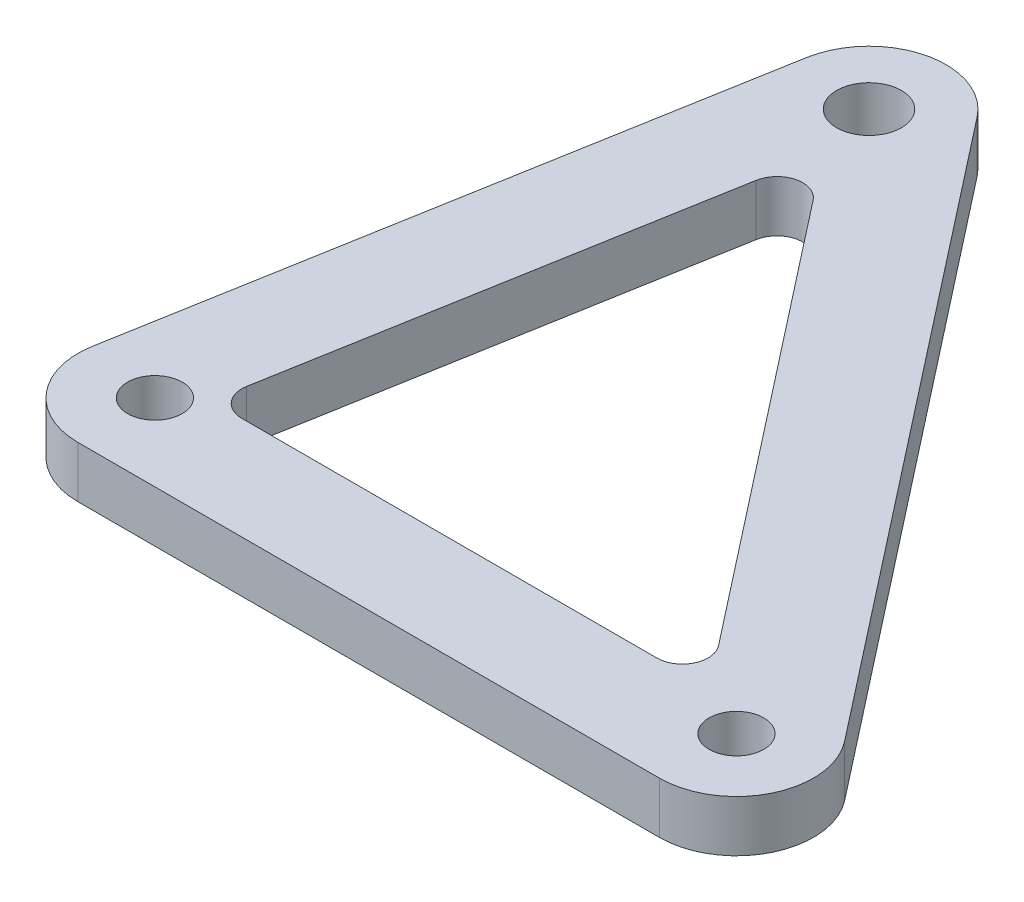
ISO-10303-21;
HEADER;
FILE_DESCRIPTION(('STEP AP214'),'2;1');
FILE_NAME('part.step','',(''),(''),'','','');
FILE_SCHEMA(('AUTOMOTIVE_DESIGN { 1 0 10303 214 1 1 1 1 }'));
ENDSEC;
DATA;
#1=APPLICATION_CONTEXT('core data for automotive mechanical design processes');
#2=APPLICATION_PROTOCOL_DEFINITION('international standard','automotive_design',2000,#1);
#3=PRODUCT_CONTEXT('',#1,'mechanical');
#4=PRODUCT('Part','Part','',(#3));
#5=PRODUCT_RELATED_PRODUCT_CATEGORY('part','',(#4));
#6=PRODUCT_DEFINITION_FORMATION('','',#4);
#7=PRODUCT_DEFINITION_CONTEXT('part definition',#1,'design');
#8=PRODUCT_DEFINITION('design','',#6,#7);
#9=PRODUCT_DEFINITION_SHAPE('','',#8);
#10=(LENGTH_UNIT() NAMED_UNIT(*) SI_UNIT(.MILLI.,.METRE.));
#11=(NAMED_UNIT(*) PLANE_ANGLE_UNIT() SI_UNIT($,.RADIAN.));
#12=(NAMED_UNIT(*) SI_UNIT($,.STERADIAN.) SOLID_ANGLE_UNIT());
#13=UNCERTAINTY_MEASURE_WITH_UNIT(LENGTH_MEASURE(1.E-05),#10,'distance_accuracy_value','');
#14=(GEOMETRIC_REPRESENTATION_CONTEXT(3) GLOBAL_UNCERTAINTY_ASSIGNED_CONTEXT((#13)) GLOBAL_UNIT_ASSIGNED_CONTEXT((#10,
#11,#12)) REPRESENTATION_CONTEXT('',''));
#15=CARTESIAN_POINT('',(0.,0.,0.));
#16=DIRECTION('',(0.,0.,1.));
#17=DIRECTION('',(1.,0.,0.));
#18=AXIS2_PLACEMENT_3D('',#15,#16,#17);
#19=CARTESIAN_POINT('',(7.56664920906916,6.35,-6.35));
#20=DIRECTION('',(0.,-1.,0.));
#21=DIRECTION('',(0.,0.,-1.));
#22=AXIS2_PLACEMENT_3D('',#19,#20,#21);
#23=CYLINDRICAL_SURFACE('',#22,3.17500000000001);
#24=CARTESIAN_POINT('',(7.56664920906916,0.,-6.35));
#25=DIRECTION('',(0.,1.,0.));
#26=DIRECTION('',(0.,0.,1.));
#27=AXIS2_PLACEMENT_3D('',#24,#25,#26);
#28=CIRCLE('',#27,3.17500000000001);
#29=CARTESIAN_POINT('',(7.56664920906916,0.,-3.175));
#30=VERTEX_POINT('',#29);
#31=CARTESIAN_POINT('',(4.43981386335675,0.,-6.90093168433451));
#32=VERTEX_POINT('',#31);
#33=EDGE_CURVE('E192',#30,#32,#28,.F.);
#34=ORIENTED_EDGE('',*,*,#33,.T.);
#35=DIRECTION('',(0.,-1.,0.));
#36=VECTOR('',#35,1.);
#37=CARTESIAN_POINT('',(4.43981386335675,6.35,-6.90093168433451));
#38=LINE('',#37,#36);
#39=CARTESIAN_POINT('',(4.43981386335675,6.35,-6.90093168433451));
#40=VERTEX_POINT('',#39);
#41=EDGE_CURVE('E11',#40,#32,#38,.T.);
#42=ORIENTED_EDGE('',*,*,#41,.F.);
#43=CARTESIAN_POINT('',(7.56664920906916,6.35,-6.35));
#44=DIRECTION('',(0.,1.,0.));
#45=DIRECTION('',(0.,0.,1.));
#46=AXIS2_PLACEMENT_3D('',#43,#44,#45);
#47=CIRCLE('',#46,3.17500000000001);
#48=CARTESIAN_POINT('',(7.56664920906916,6.35,-3.175));
#49=VERTEX_POINT('',#48);
#50=EDGE_CURVE('E264',#49,#40,#47,.F.);
#51=ORIENTED_EDGE('',*,*,#50,.F.);
#52=DIRECTION('',(0.,-1.,0.));
#53=VECTOR('',#52,1.);
#54=CARTESIAN_POINT('',(7.56664920906916,6.35,-3.175));
#55=LINE('',#54,#53);
#56=EDGE_CURVE('E214',#49,#30,#55,.T.);
#57=ORIENTED_EDGE('',*,*,#56,.T.);
#58=EDGE_LOOP('',(#34,#42,#51,#57));
#59=FACE_BOUND('',#58,.T.);
#60=ADVANCED_FACE('F45',(#59),#23,.F.);
#61=CARTESIAN_POINT('',(3.12683534571238,6.35,0.55093168433451));
#62=DIRECTION('',(-0.984830030145635,0.,-0.173521790341578));
#63=DIRECTION('',(-0.173521790341578,0.,0.984830030145636));
#64=AXIS2_PLACEMENT_3D('',#61,#62,#63);
#65=PLANE('',#64);
#66=DIRECTION('',(0.173521790341579,0.,-0.984830030145636));
#67=VECTOR('',#66,1.);
#68=CARTESIAN_POINT('',(3.12683534571238,0.,0.55093168433451));
#69=LINE('',#68,#67);
#70=CARTESIAN_POINT('',(13.8747362557186,0.,-60.4492202641175));
#71=VERTEX_POINT('',#70);
#72=EDGE_CURVE('E195',#32,#71,#69,.T.);
#73=ORIENTED_EDGE('',*,*,#72,.T.);
#74=DIRECTION('',(0.,-1.,0.));
#75=VECTOR('',#74,1.);
#76=CARTESIAN_POINT('',(13.8747362557186,6.35,-60.4492202641175));
#77=LINE('',#76,#75);
#78=CARTESIAN_POINT('',(13.8747362557186,6.35,-60.4492202641175));
#79=VERTEX_POINT('',#78);
#80=EDGE_CURVE('E55',#79,#71,#77,.T.);
#81=ORIENTED_EDGE('',*,*,#80,.F.);
#82=DIRECTION('',(0.173521790341579,0.,-0.984830030145636));
#83=VECTOR('',#82,1.);
#84=CARTESIAN_POINT('',(3.12683534571238,6.35,0.55093168433451));
#85=LINE('',#84,#83);
#86=EDGE_CURVE('E266',#40,#79,#85,.T.);
#87=ORIENTED_EDGE('',*,*,#86,.F.);
#88=ORIENTED_EDGE('',*,*,#41,.T.);
#89=EDGE_LOOP('',(#73,#81,#87,#88));
#90=FACE_BOUND('',#89,.T.);
#91=ADVANCED_FACE('F293',(#90),#65,.F.);
#92=CARTESIAN_POINT('',(17.001571601431,6.35,-59.8982885797829));
#93=DIRECTION('',(0.,-1.,0.));
#94=DIRECTION('',(0.,0.,-1.));
#95=AXIS2_PLACEMENT_3D('',#92,#93,#94);
#96=CYLINDRICAL_SURFACE('',#95,3.175);
#97=CARTESIAN_POINT('',(17.001571601431,0.,-59.8982885797829));
#98=DIRECTION('',(0.,1.,0.));
#99=DIRECTION('',(0.,0.,1.));
#100=AXIS2_PLACEMENT_3D('',#97,#98,#99);
#101=CIRCLE('',#100,3.175);
#102=CARTESIAN_POINT('',(19.5030398780009,0.,-61.853609898982));
#103=VERTEX_POINT('',#102);
#104=EDGE_CURVE('E198',#103,#71,#101,.T.);
#105=ORIENTED_EDGE('',*,*,#104,.F.);
#106=DIRECTION('',(0.,-1.,0.));
#107=VECTOR('',#106,1.);
#108=CARTESIAN_POINT('',(19.5030398780009,6.35,-61.853609898982));
#109=LINE('',#108,#107);
#110=CARTESIAN_POINT('',(19.5030398780009,6.35,-61.853609898982));
#111=VERTEX_POINT('',#110);
#112=EDGE_CURVE('E161',#111,#103,#109,.T.);
#113=ORIENTED_EDGE('',*,*,#112,.F.);
#114=CARTESIAN_POINT('',(17.001571601431,6.35,-59.8982885797829));
#115=DIRECTION('',(0.,1.,0.));
#116=DIRECTION('',(0.,0.,1.));
#117=AXIS2_PLACEMENT_3D('',#114,#115,#116);
#118=CIRCLE('',#117,3.175);
#119=EDGE_CURVE('E154',#111,#79,#118,.T.);
#120=ORIENTED_EDGE('',*,*,#119,.T.);
#121=ORIENTED_EDGE('',*,*,#80,.T.);
#122=EDGE_LOOP('',(#105,#113,#120,#121));
#123=FACE_BOUND('',#122,.T.);
#124=ADVANCED_FACE('F269',(#123),#96,.F.);
#125=CARTESIAN_POINT('',(42.1178254921996,6.35,-32.9222172731807));
#126=DIRECTION('',(0.787864024116508,0.,-0.615849234393404));
#127=DIRECTION('',(-0.615849234393404,0.,-0.787864024116508));
#128=AXIS2_PLACEMENT_3D('',#125,#126,#127);
#129=PLANE('',#128);
#130=DIRECTION('',(0.615849234393404,0.,0.787864024116508));
#131=VECTOR('',#130,1.);
#132=CARTESIAN_POINT('',(42.1178254921996,0.,-32.9222172731807));
#133=LINE('',#132,#131);
#134=CARTESIAN_POINT('',(61.3601008878836,0.,-8.30532131919906));
#135=VERTEX_POINT('',#134);
#136=EDGE_CURVE('E160',#103,#135,#133,.T.);
#137=ORIENTED_EDGE('',*,*,#136,.T.);
#138=DIRECTION('',(0.,-1.,0.));
#139=VECTOR('',#138,1.);
#140=CARTESIAN_POINT('',(61.3601008878836,6.35,-8.30532131919906));
#141=LINE('',#140,#139);
#142=CARTESIAN_POINT('',(61.3601008878836,6.35,-8.30532131919906));
#143=VERTEX_POINT('',#142);
#144=EDGE_CURVE('E157',#143,#135,#141,.T.);
#145=ORIENTED_EDGE('',*,*,#144,.F.);
#146=DIRECTION('',(0.615849234393404,0.,0.787864024116508));
#147=VECTOR('',#146,1.);
#148=CARTESIAN_POINT('',(42.1178254921996,6.35,-32.9222172731807));
#149=LINE('',#148,#147);
#150=EDGE_CURVE('E147',#111,#143,#149,.T.);
#151=ORIENTED_EDGE('',*,*,#150,.F.);
#152=ORIENTED_EDGE('',*,*,#112,.T.);
#153=EDGE_LOOP('',(#137,#145,#151,#152));
#154=FACE_BOUND('',#153,.T.);
#155=ADVANCED_FACE('F158',(#154),#129,.F.);
#156=CARTESIAN_POINT('',(58.8586326113137,6.35,-6.35));
#157=DIRECTION('',(0.,-1.,0.));
#158=DIRECTION('',(0.,0.,-1.));
#159=AXIS2_PLACEMENT_3D('',#156,#157,#158);
#160=CYLINDRICAL_SURFACE('',#159,3.175);
#161=CARTESIAN_POINT('',(58.8586326113137,0.,-6.35));
#162=DIRECTION('',(0.,1.,0.));
#163=DIRECTION('',(0.,0.,1.));
#164=AXIS2_PLACEMENT_3D('',#161,#162,#163);
#165=CIRCLE('',#164,3.175);
#166=CARTESIAN_POINT('',(58.8586326113137,0.,-3.175));
#167=VERTEX_POINT('',#166);
#168=EDGE_CURVE('E105',#135,#167,#165,.F.);
#169=ORIENTED_EDGE('',*,*,#168,.T.);
#170=DIRECTION('',(0.,-1.,0.));
#171=VECTOR('',#170,1.);
#172=CARTESIAN_POINT('',(58.8586326113137,6.35,-3.175));
#173=LINE('',#172,#171);
#174=CARTESIAN_POINT('',(58.8586326113137,6.35,-3.175));
#175=VERTEX_POINT('',#174);
#176=EDGE_CURVE('E162',#175,#167,#173,.T.);
#177=ORIENTED_EDGE('',*,*,#176,.F.);
#178=CARTESIAN_POINT('',(58.8586326113137,6.35,-6.35));
#179=DIRECTION('',(0.,1.,0.));
#180=DIRECTION('',(0.,0.,1.));
#181=AXIS2_PLACEMENT_3D('',#178,#179,#180);
#182=CIRCLE('',#181,3.175);
#183=EDGE_CURVE('E152',#143,#175,#182,.F.);
#184=ORIENTED_EDGE('',*,*,#183,.F.);
#185=ORIENTED_EDGE('',*,*,#144,.T.);
#186=EDGE_LOOP('',(#169,#177,#184,#185));
#187=FACE_BOUND('',#186,.T.);
#188=ADVANCED_FACE('F164',(#187),#160,.F.);
#189=CARTESIAN_POINT('',(-9.38050603713716,6.35,-1.65279505300353));
#190=DIRECTION('',(0.984830030145635,0.,0.173521790341578));
#191=DIRECTION('',(0.173521790341579,0.,-0.984830030145636));
#192=AXIS2_PLACEMENT_3D('',#189,#190,#191);
#193=PLANE('',#192);
#194=DIRECTION('',(-0.173521790341579,0.,0.984830030145635));
#195=VECTOR('',#194,1.);
#196=CARTESIAN_POINT('',(-9.38050603713716,0.,-1.65279505300353));
#197=LINE('',#196,#195);
#198=CARTESIAN_POINT('',(3.8418543868911,0.,-76.696843350101));
#199=VERTEX_POINT('',#198);
#200=CARTESIAN_POINT('',(-9.38050603713717,0.,-1.65279505300353));
#201=VERTEX_POINT('',#200);
#202=EDGE_CURVE('E179',#199,#201,#197,.T.);
#203=ORIENTED_EDGE('',*,*,#202,.T.);
#204=DIRECTION('',(0.,-1.,0.));
#205=VECTOR('',#204,1.);
#206=CARTESIAN_POINT('',(-9.38050603713717,6.35,-1.65279505300353));
#207=LINE('',#206,#205);
#208=CARTESIAN_POINT('',(-9.38050603713717,6.35,-1.65279505300353));
#209=VERTEX_POINT('',#208);
#210=EDGE_CURVE('E49',#209,#201,#207,.T.);
#211=ORIENTED_EDGE('',*,*,#210,.F.);
#212=DIRECTION('',(-0.173521790341579,0.,0.984830030145635));
#213=VECTOR('',#212,1.);
#214=CARTESIAN_POINT('',(-9.38050603713716,6.35,-1.65279505300353));
#215=LINE('',#214,#213);
#216=CARTESIAN_POINT('',(3.8418543868911,6.35,-76.696843350101));
#217=VERTEX_POINT('',#216);
#218=EDGE_CURVE('E213',#217,#209,#215,.T.);
#219=ORIENTED_EDGE('',*,*,#218,.F.);
#220=DIRECTION('',(0.,-1.,0.));
#221=VECTOR('',#220,1.);
#222=CARTESIAN_POINT('',(3.8418543868911,6.35,-76.696843350101));
#223=LINE('',#222,#221);
#224=EDGE_CURVE('E178',#217,#199,#223,.T.);
#225=ORIENTED_EDGE('',*,*,#224,.T.);
#226=EDGE_LOOP('',(#203,#211,#219,#225));
#227=FACE_BOUND('',#226,.T.);
#228=ADVANCED_FACE('F47',(#227),#193,.F.);
#229=CARTESIAN_POINT('',(0.,6.35,0.));
#230=DIRECTION('',(0.,-1.,0.));
#231=DIRECTION('',(0.,0.,-1.));
#232=AXIS2_PLACEMENT_3D('',#229,#230,#231);
#233=CYLINDRICAL_SURFACE('',#232,9.525);
#234=CARTESIAN_POINT('',(0.,0.,0.));
#235=DIRECTION('',(0.,1.,0.));
#236=DIRECTION('',(0.,0.,1.));
#237=AXIS2_PLACEMENT_3D('',#234,#235,#236);
#238=CIRCLE('',#237,9.525);
#239=CARTESIAN_POINT('',(0.,0.,9.525));
#240=VERTEX_POINT('',#239);
#241=EDGE_CURVE('E182',#201,#240,#238,.T.);
#242=ORIENTED_EDGE('',*,*,#241,.T.);
#243=DIRECTION('',(0.,-1.,0.));
#244=VECTOR('',#243,1.);
#245=CARTESIAN_POINT('',(0.,6.35,9.525));
#246=LINE('',#245,#244);
#247=CARTESIAN_POINT('',(0.,6.35,9.525));
#248=VERTEX_POINT('',#247);
#249=EDGE_CURVE('E229',#248,#240,#246,.T.);
#250=ORIENTED_EDGE('',*,*,#249,.F.);
#251=CARTESIAN_POINT('',(0.,6.35,0.));
#252=DIRECTION('',(0.,1.,0.));
#253=DIRECTION('',(0.,0.,1.));
#254=AXIS2_PLACEMENT_3D('',#251,#252,#253);
#255=CIRCLE('',#254,9.525);
#256=EDGE_CURVE('E120',#209,#248,#255,.T.);
#257=ORIENTED_EDGE('',*,*,#256,.F.);
#258=ORIENTED_EDGE('',*,*,#210,.T.);
#259=EDGE_LOOP('',(#242,#250,#257,#258));
#260=FACE_BOUND('',#259,.T.);
#261=ADVANCED_FACE('F235',(#260),#233,.T.);
#262=CARTESIAN_POINT('',(0.,6.35,9.525));
#263=DIRECTION('',(0.,0.,-1.));
#264=DIRECTION('',(-1.,0.,0.));
#265=AXIS2_PLACEMENT_3D('',#262,#263,#264);
#266=PLANE('',#265);
#267=DIRECTION('',(1.,0.,0.));
#268=VECTOR('',#267,1.);
#269=CARTESIAN_POINT('',(0.,0.,9.525));
#270=LINE('',#269,#268);
#271=CARTESIAN_POINT('',(71.882,0.,9.52500000000001));
#272=VERTEX_POINT('',#271);
#273=EDGE_CURVE('E184',#240,#272,#270,.T.);
#274=ORIENTED_EDGE('',*,*,#273,.T.);
#275=DIRECTION('',(0.,-1.,0.));
#276=VECTOR('',#275,1.);
#277=CARTESIAN_POINT('',(71.882,6.35,9.52500000000001));
#278=LINE('',#277,#276);
#279=CARTESIAN_POINT('',(71.882,6.35,9.52500000000001));
#280=VERTEX_POINT('',#279);
#281=EDGE_CURVE('E227',#280,#272,#278,.T.);
#282=ORIENTED_EDGE('',*,*,#281,.F.);
#283=DIRECTION('',(1.,0.,0.));
#284=VECTOR('',#283,1.);
#285=CARTESIAN_POINT('',(0.,6.35,9.525));
#286=LINE('',#285,#284);
#287=EDGE_CURVE('E256',#248,#280,#286,.T.);
#288=ORIENTED_EDGE('',*,*,#287,.F.);
#289=ORIENTED_EDGE('',*,*,#249,.T.);
#290=EDGE_LOOP('',(#274,#282,#288,#289));
#291=FACE_BOUND('',#290,.T.);
#292=ADVANCED_FACE('F247',(#291),#266,.F.);
#293=CARTESIAN_POINT('',(71.882,6.35,0.));
#294=DIRECTION('',(0.,-1.,0.));
#295=DIRECTION('',(0.,0.,-1.));
#296=AXIS2_PLACEMENT_3D('',#293,#294,#295);
#297=CYLINDRICAL_SURFACE('',#296,9.52500000000001);
#298=CARTESIAN_POINT('',(71.882,0.,0.));
#299=DIRECTION('',(0.,1.,0.));
#300=DIRECTION('',(0.,0.,1.));
#301=AXIS2_PLACEMENT_3D('',#298,#299,#300);
#302=CIRCLE('',#301,9.52500000000001);
#303=CARTESIAN_POINT('',(79.3864048297097,0.,-5.86596395759717));
#304=VERTEX_POINT('',#303);
#305=EDGE_CURVE('E186',#272,#304,#302,.T.);
#306=ORIENTED_EDGE('',*,*,#305,.T.);
#307=DIRECTION('',(0.,-1.,0.));
#308=VECTOR('',#307,1.);
#309=CARTESIAN_POINT('',(79.3864048297097,6.35,-5.86596395759717));
#310=LINE('',#309,#308);
#311=CARTESIAN_POINT('',(79.3864048297097,6.35,-5.86596395759717));
#312=VERTEX_POINT('',#311);
#313=EDGE_CURVE('E224',#312,#304,#310,.T.);
#314=ORIENTED_EDGE('',*,*,#313,.F.);
#315=CARTESIAN_POINT('',(71.882,6.35,0.));
#316=DIRECTION('',(0.,1.,0.));
#317=DIRECTION('',(0.,0.,1.));
#318=AXIS2_PLACEMENT_3D('',#315,#316,#317);
#319=CIRCLE('',#318,9.52500000000001);
#320=EDGE_CURVE('E252',#280,#312,#319,.T.);
#321=ORIENTED_EDGE('',*,*,#320,.F.);
#322=ORIENTED_EDGE('',*,*,#281,.T.);
#323=EDGE_LOOP('',(#306,#314,#321,#322));
#324=FACE_BOUND('',#323,.T.);
#325=ADVANCED_FACE('F250',(#324),#297,.T.);
#326=CARTESIAN_POINT('',(52.1236985984793,6.35,-40.7435025499769));
#327=DIRECTION('',(-0.787864024116509,0.,0.615849234393404));
#328=DIRECTION('',(0.615849234393404,0.,0.787864024116509));
#329=AXIS2_PLACEMENT_3D('',#326,#327,#328);
#330=PLANE('',#329);
#331=DIRECTION('',(-0.615849234393404,0.,-0.787864024116509));
#332=VECTOR('',#331,1.);
#333=CARTESIAN_POINT('',(52.1236985984793,0.,-40.7435025499769));
#334=LINE('',#333,#332);
#335=CARTESIAN_POINT('',(20.726765253738,0.,-80.9100122546946));
#336=VERTEX_POINT('',#335);
#337=EDGE_CURVE('E188',#304,#336,#334,.T.);
#338=ORIENTED_EDGE('',*,*,#337,.T.);
#339=DIRECTION('',(0.,-1.,0.));
#340=VECTOR('',#339,1.);
#341=CARTESIAN_POINT('',(20.726765253738,6.35,-80.9100122546946));
#342=LINE('',#341,#340);
#343=CARTESIAN_POINT('',(20.726765253738,6.35,-80.9100122546946));
#344=VERTEX_POINT('',#343);
#345=EDGE_CURVE('E221',#344,#336,#342,.T.);
#346=ORIENTED_EDGE('',*,*,#345,.F.);
#347=DIRECTION('',(-0.615849234393404,0.,-0.787864024116509));
#348=VECTOR('',#347,1.);
#349=CARTESIAN_POINT('',(52.1236985984793,6.35,-40.7435025499769));
#350=LINE('',#349,#348);
#351=EDGE_CURVE('E255',#312,#344,#350,.T.);
#352=ORIENTED_EDGE('',*,*,#351,.F.);
#353=ORIENTED_EDGE('',*,*,#313,.T.);
#354=EDGE_LOOP('',(#338,#346,#352,#353));
#355=FACE_BOUND('',#354,.T.);
#356=ADVANCED_FACE('F302',(#355),#330,.F.);
#357=CARTESIAN_POINT('',(0.,6.35,0.));
#358=DIRECTION('',(0.,-1.,0.));
#359=DIRECTION('',(0.,0.,-1.));
#360=AXIS2_PLACEMENT_3D('',#357,#358,#359);
#361=CYLINDRICAL_SURFACE('',#360,3.3782);
#362=CARTESIAN_POINT('',(0.,6.35,0.));
#363=DIRECTION('',(0.,1.,0.));
#364=DIRECTION('',(0.,0.,1.));
#365=AXIS2_PLACEMENT_3D('',#362,#363,#364);
#366=CIRCLE('',#365,3.3782);
#367=CARTESIAN_POINT('',(0.,6.35,3.3782));
#368=VERTEX_POINT('',#367);
#369=EDGE_CURVE('E172',#368,#368,#366,.T.);
#370=ORIENTED_EDGE('',*,*,#369,.T.);
#371=EDGE_LOOP('',(#370));
#372=FACE_BOUND('',#371,.T.);
#373=CARTESIAN_POINT('',(0.,0.,0.));
#374=DIRECTION('',(0.,1.,0.));
#375=DIRECTION('',(0.,0.,1.));
#376=AXIS2_PLACEMENT_3D('',#373,#374,#375);
#377=CIRCLE('',#376,3.3782);
#378=CARTESIAN_POINT('',(0.,0.,3.3782));
#379=VERTEX_POINT('',#378);
#380=EDGE_CURVE('E207',#379,#379,#377,.T.);
#381=ORIENTED_EDGE('',*,*,#380,.F.);
#382=EDGE_LOOP('',(#381));
#383=FACE_BOUND('',#382,.T.);
#384=ADVANCED_FACE('F288',(#372,#383),#361,.F.);
#385=CARTESIAN_POINT('',(71.882,6.35,0.));
#386=DIRECTION('',(0.,-1.,0.));
#387=DIRECTION('',(0.,0.,-1.));
#388=AXIS2_PLACEMENT_3D('',#385,#386,#387);
#389=CYLINDRICAL_SURFACE('',#388,3.37819999999999);
#390=CARTESIAN_POINT('',(71.882,6.35,0.));
#391=DIRECTION('',(0.,1.,0.));
#392=DIRECTION('',(0.,0.,1.));
#393=AXIS2_PLACEMENT_3D('',#390,#391,#392);
#394=CIRCLE('',#393,3.37819999999999);
#395=CARTESIAN_POINT('',(71.882,6.35,3.37819999999999));
#396=VERTEX_POINT('',#395);
#397=EDGE_CURVE('E166',#396,#396,#394,.T.);
#398=ORIENTED_EDGE('',*,*,#397,.T.);
#399=EDGE_LOOP('',(#398));
#400=FACE_BOUND('',#399,.T.);
#401=CARTESIAN_POINT('',(71.882,0.,0.));
#402=DIRECTION('',(0.,1.,0.));
#403=DIRECTION('',(0.,0.,1.));
#404=AXIS2_PLACEMENT_3D('',#401,#402,#403);
#405=CIRCLE('',#404,3.37819999999999);
#406=CARTESIAN_POINT('',(71.882,0.,3.37819999999999));
#407=VERTEX_POINT('',#406);
#408=EDGE_CURVE('E204',#407,#407,#405,.T.);
#409=ORIENTED_EDGE('',*,*,#408,.F.);
#410=EDGE_LOOP('',(#409));
#411=FACE_BOUND('',#410,.T.);
#412=ADVANCED_FACE('F279',(#400,#411),#389,.F.);
#413=CARTESIAN_POINT('',(0.,6.35,-3.175));
#414=DIRECTION('',(0.,0.,1.));
#415=DIRECTION('',(1.,0.,0.));
#416=AXIS2_PLACEMENT_3D('',#413,#414,#415);
#417=PLANE('',#416);
#418=DIRECTION('',(-1.,0.,0.));
#419=VECTOR('',#418,1.);
#420=CARTESIAN_POINT('',(0.,0.,-3.175));
#421=LINE('',#420,#419);
#422=EDGE_CURVE('E111',#167,#30,#421,.T.);
#423=ORIENTED_EDGE('',*,*,#422,.T.);
#424=ORIENTED_EDGE('',*,*,#56,.F.);
#425=DIRECTION('',(-1.,0.,0.));
#426=VECTOR('',#425,1.);
#427=CARTESIAN_POINT('',(0.,6.35,-3.175));
#428=LINE('',#427,#426);
#429=EDGE_CURVE('E64',#175,#49,#428,.T.);
#430=ORIENTED_EDGE('',*,*,#429,.F.);
#431=ORIENTED_EDGE('',*,*,#176,.T.);
#432=EDGE_LOOP('',(#423,#424,#430,#431));
#433=FACE_BOUND('',#432,.T.);
#434=ADVANCED_FACE('F276',(#433),#417,.F.);
#435=CARTESIAN_POINT('',(13.2223604240283,6.35,-75.0440482970974));
#436=DIRECTION('',(0.,-1.,0.));
#437=DIRECTION('',(0.,0.,-1.));
#438=AXIS2_PLACEMENT_3D('',#435,#436,#437);
#439=CYLINDRICAL_SURFACE('',#438,9.52500000000002);
#440=CARTESIAN_POINT('',(13.2223604240283,0.,-75.0440482970974));
#441=DIRECTION('',(0.,1.,0.));
#442=DIRECTION('',(0.,0.,1.));
#443=AXIS2_PLACEMENT_3D('',#440,#441,#442);
#444=CIRCLE('',#443,9.52500000000002);
#445=EDGE_CURVE('E190',#336,#199,#444,.T.);
#446=ORIENTED_EDGE('',*,*,#445,.T.);
#447=ORIENTED_EDGE('',*,*,#224,.F.);
#448=CARTESIAN_POINT('',(13.2223604240283,6.35,-75.0440482970974));
#449=DIRECTION('',(0.,1.,0.));
#450=DIRECTION('',(0.,0.,1.));
#451=AXIS2_PLACEMENT_3D('',#448,#449,#450);
#452=CIRCLE('',#451,9.52500000000002);
#453=EDGE_CURVE('E258',#344,#217,#452,.T.);
#454=ORIENTED_EDGE('',*,*,#453,.F.);
#455=ORIENTED_EDGE('',*,*,#345,.T.);
#456=EDGE_LOOP('',(#446,#447,#454,#455));
#457=FACE_BOUND('',#456,.T.);
#458=ADVANCED_FACE('F278',(#457),#439,.T.);
#459=CARTESIAN_POINT('',(13.2223604240283,6.35,-75.0440482970974));
#460=DIRECTION('',(0.,-1.,0.));
#461=DIRECTION('',(0.,0.,-1.));
#462=AXIS2_PLACEMENT_3D('',#459,#460,#461);
#463=CYLINDRICAL_SURFACE('',#462,4.);
#464=CARTESIAN_POINT('',(13.2223604240283,6.35,-75.0440482970974));
#465=DIRECTION('',(0.,1.,0.));
#466=DIRECTION('',(0.,0.,1.));
#467=AXIS2_PLACEMENT_3D('',#464,#465,#466);
#468=CIRCLE('',#467,4.);
#469=CARTESIAN_POINT('',(13.2223604240283,6.35,-71.0440482970974));
#470=VERTEX_POINT('',#469);
#471=EDGE_CURVE('E175',#470,#470,#468,.T.);
#472=ORIENTED_EDGE('',*,*,#471,.T.);
#473=EDGE_LOOP('',(#472));
#474=FACE_BOUND('',#473,.T.);
#475=CARTESIAN_POINT('',(13.2223604240283,0.,-75.0440482970974));
#476=DIRECTION('',(0.,1.,0.));
#477=DIRECTION('',(0.,0.,1.));
#478=AXIS2_PLACEMENT_3D('',#475,#476,#477);
#479=CIRCLE('',#478,4.);
#480=CARTESIAN_POINT('',(13.2223604240283,0.,-71.0440482970974));
#481=VERTEX_POINT('',#480);
#482=EDGE_CURVE('E210',#481,#481,#479,.T.);
#483=ORIENTED_EDGE('',*,*,#482,.F.);
#484=EDGE_LOOP('',(#483));
#485=FACE_BOUND('',#484,.T.);
#486=ADVANCED_FACE('F285',(#474,#485),#463,.F.);
#487=CARTESIAN_POINT('',(0.,6.35,0.));
#488=DIRECTION('',(0.,1.,0.));
#489=DIRECTION('',(0.,0.,1.));
#490=AXIS2_PLACEMENT_3D('',#487,#488,#489);
#491=PLANE('',#490);
#492=ORIENTED_EDGE('',*,*,#218,.T.);
#493=ORIENTED_EDGE('',*,*,#256,.T.);
#494=ORIENTED_EDGE('',*,*,#287,.T.);
#495=ORIENTED_EDGE('',*,*,#320,.T.);
#496=ORIENTED_EDGE('',*,*,#351,.T.);
#497=ORIENTED_EDGE('',*,*,#453,.T.);
#498=EDGE_LOOP('',(#492,#493,#494,#495,#496,#497));
#499=FACE_BOUND('',#498,.T.);
#500=ORIENTED_EDGE('',*,*,#50,.T.);
#501=ORIENTED_EDGE('',*,*,#86,.T.);
#502=ORIENTED_EDGE('',*,*,#119,.F.);
#503=ORIENTED_EDGE('',*,*,#150,.T.);
#504=ORIENTED_EDGE('',*,*,#183,.T.);
#505=ORIENTED_EDGE('',*,*,#429,.T.);
#506=EDGE_LOOP('',(#500,#501,#502,#503,#504,#505));
#507=FACE_BOUND('',#506,.T.);
#508=ORIENTED_EDGE('',*,*,#397,.F.);
#509=EDGE_LOOP('',(#508));
#510=FACE_BOUND('',#509,.T.);
#511=ORIENTED_EDGE('',*,*,#369,.F.);
#512=EDGE_LOOP('',(#511));
#513=FACE_BOUND('',#512,.T.);
#514=ORIENTED_EDGE('',*,*,#471,.F.);
#515=EDGE_LOOP('',(#514));
#516=FACE_BOUND('',#515,.T.);
#517=ADVANCED_FACE('F149',(#499,#507,#510,#513,#516),#491,.T.);
#518=CARTESIAN_POINT('',(0.,0.,0.));
#519=DIRECTION('',(0.,1.,0.));
#520=DIRECTION('',(0.,0.,1.));
#521=AXIS2_PLACEMENT_3D('',#518,#519,#520);
#522=PLANE('',#521);
#523=ORIENTED_EDGE('',*,*,#202,.F.);
#524=ORIENTED_EDGE('',*,*,#445,.F.);
#525=ORIENTED_EDGE('',*,*,#337,.F.);
#526=ORIENTED_EDGE('',*,*,#305,.F.);
#527=ORIENTED_EDGE('',*,*,#273,.F.);
#528=ORIENTED_EDGE('',*,*,#241,.F.);
#529=EDGE_LOOP('',(#523,#524,#525,#526,#527,#528));
#530=FACE_BOUND('',#529,.T.);
#531=ORIENTED_EDGE('',*,*,#33,.F.);
#532=ORIENTED_EDGE('',*,*,#422,.F.);
#533=ORIENTED_EDGE('',*,*,#168,.F.);
#534=ORIENTED_EDGE('',*,*,#136,.F.);
#535=ORIENTED_EDGE('',*,*,#104,.T.);
#536=ORIENTED_EDGE('',*,*,#72,.F.);
#537=EDGE_LOOP('',(#531,#532,#533,#534,#535,#536));
#538=FACE_BOUND('',#537,.T.);
#539=ORIENTED_EDGE('',*,*,#408,.T.);
#540=EDGE_LOOP('',(#539));
#541=FACE_BOUND('',#540,.T.);
#542=ORIENTED_EDGE('',*,*,#380,.T.);
#543=EDGE_LOOP('',(#542));
#544=FACE_BOUND('',#543,.T.);
#545=ORIENTED_EDGE('',*,*,#482,.T.);
#546=EDGE_LOOP('',(#545));
#547=FACE_BOUND('',#546,.T.);
#548=ADVANCED_FACE('F242',(#530,#538,#541,#544,#547),#522,.F.);
#549=CLOSED_SHELL('',(#60,#91,#124,#155,#188,#228,#261,#292,#325,#356,#384,#412,#434,#458,#486,
#517,#548));
#550=MANIFOLD_SOLID_BREP('B2',#549);
#551=ADVANCED_BREP_SHAPE_REPRESENTATION('',(#18,#550),#14);
#552=SHAPE_DEFINITION_REPRESENTATION(#9,#551);
ENDSEC;
END-ISO-10303-21;
